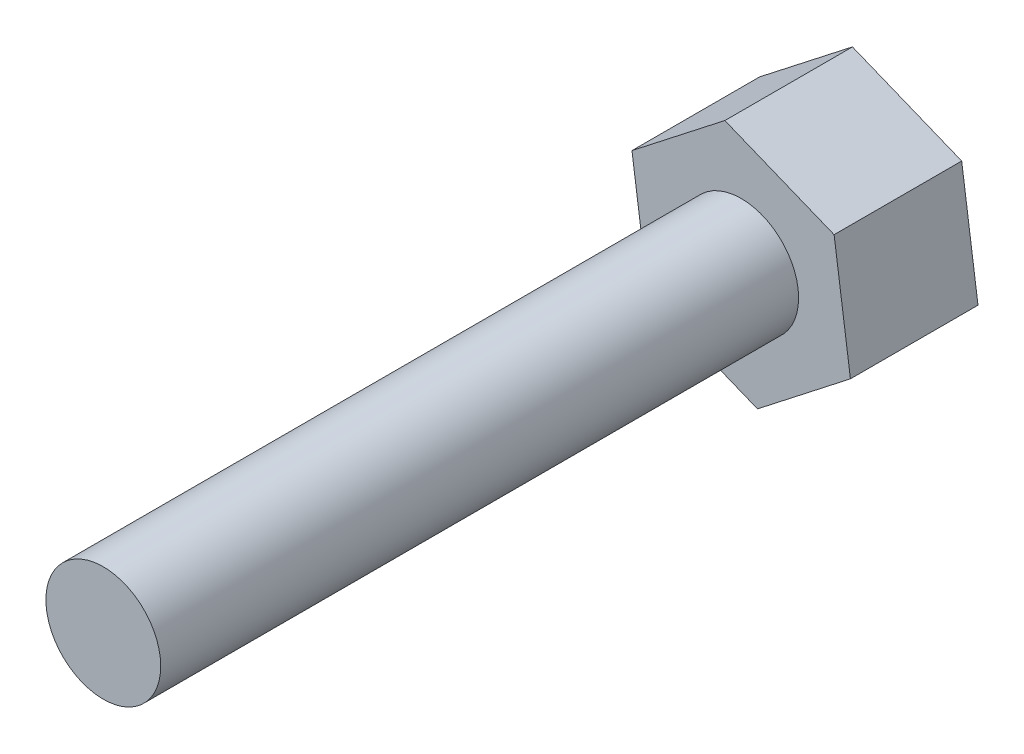
ISO-10303-21;
HEADER;
FILE_DESCRIPTION(('STEP AP214'),'2;1');
FILE_NAME('part.step','',(''),(''),'','','');
FILE_SCHEMA(('AUTOMOTIVE_DESIGN { 1 0 10303 214 1 1 1 1 }'));
ENDSEC;
DATA;
#1=APPLICATION_CONTEXT('core data for automotive mechanical design processes');
#2=APPLICATION_PROTOCOL_DEFINITION('international standard','automotive_design',2000,#1);
#3=PRODUCT_CONTEXT('',#1,'mechanical');
#4=PRODUCT('Part','Part','',(#3));
#5=PRODUCT_RELATED_PRODUCT_CATEGORY('part','',(#4));
#6=PRODUCT_DEFINITION_FORMATION('','',#4);
#7=PRODUCT_DEFINITION_CONTEXT('part definition',#1,'design');
#8=PRODUCT_DEFINITION('design','',#6,#7);
#9=PRODUCT_DEFINITION_SHAPE('','',#8);
#10=(LENGTH_UNIT() NAMED_UNIT(*) SI_UNIT(.MILLI.,.METRE.));
#11=(NAMED_UNIT(*) PLANE_ANGLE_UNIT() SI_UNIT($,.RADIAN.));
#12=(NAMED_UNIT(*) SI_UNIT($,.STERADIAN.) SOLID_ANGLE_UNIT());
#13=UNCERTAINTY_MEASURE_WITH_UNIT(LENGTH_MEASURE(1.E-05),#10,'distance_accuracy_value','');
#14=(GEOMETRIC_REPRESENTATION_CONTEXT(3) GLOBAL_UNCERTAINTY_ASSIGNED_CONTEXT((#13)) GLOBAL_UNIT_ASSIGNED_CONTEXT((#10,
#11,#12)) REPRESENTATION_CONTEXT('',''));
#15=CARTESIAN_POINT('',(0.,0.,0.));
#16=DIRECTION('',(0.,0.,1.));
#17=DIRECTION('',(1.,0.,0.));
#18=AXIS2_PLACEMENT_3D('',#15,#16,#17);
#19=CARTESIAN_POINT('',(4.28109526931957,-1.73365412592678,5.));
#20=DIRECTION('',(-0.990378927300956,-0.138382008795245,0.));
#21=DIRECTION('',(0.138382008795245,-0.990378927300956,0.));
#22=AXIS2_PLACEMENT_3D('',#19,#20,#21);
#23=PLANE('',#22);
#24=DIRECTION('',(-0.138382008795245,0.990378927300956,0.));
#25=VECTOR('',#24,1.);
#26=CARTESIAN_POINT('',(4.28109526931957,-1.73365412592678,0.));
#27=LINE('',#26,#25);
#28=CARTESIAN_POINT('',(4.28109526931957,-1.73365412592678,0.));
#29=VERTEX_POINT('',#28);
#30=CARTESIAN_POINT('',(3.64193614908808,2.84071019628874,0.));
#31=VERTEX_POINT('',#30);
#32=EDGE_CURVE('E119',#29,#31,#27,.T.);
#33=ORIENTED_EDGE('',*,*,#32,.T.);
#34=DIRECTION('',(0.,0.,-1.));
#35=VECTOR('',#34,1.);
#36=CARTESIAN_POINT('',(3.64193614908808,2.84071019628874,5.));
#37=LINE('',#36,#35);
#38=CARTESIAN_POINT('',(3.64193614908808,2.84071019628874,5.));
#39=VERTEX_POINT('',#38);
#40=EDGE_CURVE('E36',#39,#31,#37,.T.);
#41=ORIENTED_EDGE('',*,*,#40,.F.);
#42=DIRECTION('',(-0.138382008795245,0.990378927300956,0.));
#43=VECTOR('',#42,1.);
#44=CARTESIAN_POINT('',(4.28109526931957,-1.73365412592678,5.));
#45=LINE('',#44,#43);
#46=CARTESIAN_POINT('',(4.28109526931957,-1.73365412592678,5.));
#47=VERTEX_POINT('',#46);
#48=EDGE_CURVE('E130',#47,#39,#45,.T.);
#49=ORIENTED_EDGE('',*,*,#48,.F.);
#50=DIRECTION('',(0.,0.,-1.));
#51=VECTOR('',#50,1.);
#52=CARTESIAN_POINT('',(4.28109526931957,-1.73365412592678,5.));
#53=LINE('',#52,#51);
#54=EDGE_CURVE('E115',#47,#29,#53,.T.);
#55=ORIENTED_EDGE('',*,*,#54,.T.);
#56=EDGE_LOOP('',(#33,#41,#49,#55));
#57=FACE_BOUND('',#56,.T.);
#58=ADVANCED_FACE('F33',(#57),#23,.F.);
#59=CARTESIAN_POINT('',(3.64193614908808,2.84071019628874,5.));
#60=DIRECTION('',(-0.375347128607074,-0.926884314813032,0.));
#61=DIRECTION('',(0.926884314813032,-0.375347128607074,0.));
#62=AXIS2_PLACEMENT_3D('',#59,#60,#61);
#63=PLANE('',#62);
#64=DIRECTION('',(-0.926884314813032,0.375347128607074,0.));
#65=VECTOR('',#64,1.);
#66=CARTESIAN_POINT('',(3.64193614908808,2.84071019628874,0.));
#67=LINE('',#66,#65);
#68=CARTESIAN_POINT('',(-0.639159120231486,4.57436432221552,0.));
#69=VERTEX_POINT('',#68);
#70=EDGE_CURVE('E122',#31,#69,#67,.T.);
#71=ORIENTED_EDGE('',*,*,#70,.T.);
#72=DIRECTION('',(0.,0.,-1.));
#73=VECTOR('',#72,1.);
#74=CARTESIAN_POINT('',(-0.639159120231486,4.57436432221552,5.));
#75=LINE('',#74,#73);
#76=CARTESIAN_POINT('',(-0.639159120231486,4.57436432221552,5.));
#77=VERTEX_POINT('',#76);
#78=EDGE_CURVE('E133',#77,#69,#75,.T.);
#79=ORIENTED_EDGE('',*,*,#78,.F.);
#80=DIRECTION('',(-0.926884314813032,0.375347128607074,0.));
#81=VECTOR('',#80,1.);
#82=CARTESIAN_POINT('',(3.64193614908808,2.84071019628874,5.));
#83=LINE('',#82,#81);
#84=EDGE_CURVE('E88',#39,#77,#83,.T.);
#85=ORIENTED_EDGE('',*,*,#84,.F.);
#86=ORIENTED_EDGE('',*,*,#40,.T.);
#87=EDGE_LOOP('',(#71,#79,#85,#86));
#88=FACE_BOUND('',#87,.T.);
#89=ADVANCED_FACE('F138',(#88),#63,.F.);
#90=CARTESIAN_POINT('',(-0.639159120231486,4.57436432221552,5.));
#91=DIRECTION('',(0.615031798693882,-0.788502306017787,0.));
#92=DIRECTION('',(0.788502306017787,0.615031798693882,0.));
#93=AXIS2_PLACEMENT_3D('',#90,#91,#92);
#94=PLANE('',#93);
#95=DIRECTION('',(-0.788502306017787,-0.615031798693882,0.));
#96=VECTOR('',#95,1.);
#97=CARTESIAN_POINT('',(-0.639159120231486,4.57436432221552,0.));
#98=LINE('',#97,#96);
#99=CARTESIAN_POINT('',(-4.28109526931957,1.73365412592678,0.));
#100=VERTEX_POINT('',#99);
#101=EDGE_CURVE('E125',#69,#100,#98,.T.);
#102=ORIENTED_EDGE('',*,*,#101,.T.);
#103=DIRECTION('',(0.,0.,-1.));
#104=VECTOR('',#103,1.);
#105=CARTESIAN_POINT('',(-4.28109526931957,1.73365412592678,5.));
#106=LINE('',#105,#104);
#107=CARTESIAN_POINT('',(-4.28109526931957,1.73365412592678,5.));
#108=VERTEX_POINT('',#107);
#109=EDGE_CURVE('E110',#108,#100,#106,.T.);
#110=ORIENTED_EDGE('',*,*,#109,.F.);
#111=DIRECTION('',(-0.788502306017787,-0.615031798693882,0.));
#112=VECTOR('',#111,1.);
#113=CARTESIAN_POINT('',(-0.639159120231486,4.57436432221552,5.));
#114=LINE('',#113,#112);
#115=EDGE_CURVE('E101',#77,#108,#114,.T.);
#116=ORIENTED_EDGE('',*,*,#115,.F.);
#117=ORIENTED_EDGE('',*,*,#78,.T.);
#118=EDGE_LOOP('',(#102,#110,#116,#117));
#119=FACE_BOUND('',#118,.T.);
#120=ADVANCED_FACE('F144',(#119),#94,.F.);
#121=CARTESIAN_POINT('',(-4.28109526931957,1.73365412592678,5.));
#122=DIRECTION('',(0.990378927300956,0.138382008795245,0.));
#123=DIRECTION('',(-0.138382008795245,0.990378927300956,0.));
#124=AXIS2_PLACEMENT_3D('',#121,#122,#123);
#125=PLANE('',#124);
#126=DIRECTION('',(0.138382008795245,-0.990378927300956,0.));
#127=VECTOR('',#126,1.);
#128=CARTESIAN_POINT('',(-4.28109526931957,1.73365412592678,0.));
#129=LINE('',#128,#127);
#130=CARTESIAN_POINT('',(-3.64193614908808,-2.84071019628874,0.));
#131=VERTEX_POINT('',#130);
#132=EDGE_CURVE('E109',#100,#131,#129,.T.);
#133=ORIENTED_EDGE('',*,*,#132,.T.);
#134=DIRECTION('',(0.,0.,-1.));
#135=VECTOR('',#134,1.);
#136=CARTESIAN_POINT('',(-3.64193614908808,-2.84071019628874,5.));
#137=LINE('',#136,#135);
#138=CARTESIAN_POINT('',(-3.64193614908808,-2.84071019628874,5.));
#139=VERTEX_POINT('',#138);
#140=EDGE_CURVE('E106',#139,#131,#137,.T.);
#141=ORIENTED_EDGE('',*,*,#140,.F.);
#142=DIRECTION('',(0.138382008795245,-0.990378927300956,0.));
#143=VECTOR('',#142,1.);
#144=CARTESIAN_POINT('',(-4.28109526931957,1.73365412592678,5.));
#145=LINE('',#144,#143);
#146=EDGE_CURVE('E95',#108,#139,#145,.T.);
#147=ORIENTED_EDGE('',*,*,#146,.F.);
#148=ORIENTED_EDGE('',*,*,#109,.T.);
#149=EDGE_LOOP('',(#133,#141,#147,#148));
#150=FACE_BOUND('',#149,.T.);
#151=ADVANCED_FACE('F107',(#150),#125,.F.);
#152=CARTESIAN_POINT('',(-3.64193614908808,-2.84071019628874,5.));
#153=DIRECTION('',(0.375347128607075,0.926884314813032,0.));
#154=DIRECTION('',(-0.926884314813032,0.375347128607075,0.));
#155=AXIS2_PLACEMENT_3D('',#152,#153,#154);
#156=PLANE('',#155);
#157=DIRECTION('',(0.926884314813032,-0.375347128607075,0.));
#158=VECTOR('',#157,1.);
#159=CARTESIAN_POINT('',(-3.64193614908808,-2.84071019628874,0.));
#160=LINE('',#159,#158);
#161=CARTESIAN_POINT('',(0.639159120231486,-4.57436432221552,0.));
#162=VERTEX_POINT('',#161);
#163=EDGE_CURVE('E73',#131,#162,#160,.T.);
#164=ORIENTED_EDGE('',*,*,#163,.T.);
#165=DIRECTION('',(0.,0.,-1.));
#166=VECTOR('',#165,1.);
#167=CARTESIAN_POINT('',(0.639159120231486,-4.57436432221552,5.));
#168=LINE('',#167,#166);
#169=CARTESIAN_POINT('',(0.639159120231486,-4.57436432221552,5.));
#170=VERTEX_POINT('',#169);
#171=EDGE_CURVE('E111',#170,#162,#168,.T.);
#172=ORIENTED_EDGE('',*,*,#171,.F.);
#173=DIRECTION('',(0.926884314813032,-0.375347128607075,0.));
#174=VECTOR('',#173,1.);
#175=CARTESIAN_POINT('',(-3.64193614908808,-2.84071019628874,5.));
#176=LINE('',#175,#174);
#177=EDGE_CURVE('E99',#139,#170,#176,.T.);
#178=ORIENTED_EDGE('',*,*,#177,.F.);
#179=ORIENTED_EDGE('',*,*,#140,.T.);
#180=EDGE_LOOP('',(#164,#172,#178,#179));
#181=FACE_BOUND('',#180,.T.);
#182=ADVANCED_FACE('F113',(#181),#156,.F.);
#183=CARTESIAN_POINT('',(0.639159120231486,-4.57436432221552,5.));
#184=DIRECTION('',(-0.615031798693882,0.788502306017787,0.));
#185=DIRECTION('',(-0.788502306017787,-0.615031798693882,0.));
#186=AXIS2_PLACEMENT_3D('',#183,#184,#185);
#187=PLANE('',#186);
#188=DIRECTION('',(0.788502306017787,0.615031798693882,0.));
#189=VECTOR('',#188,1.);
#190=CARTESIAN_POINT('',(0.639159120231486,-4.57436432221552,0.));
#191=LINE('',#190,#189);
#192=EDGE_CURVE('E79',#162,#29,#191,.T.);
#193=ORIENTED_EDGE('',*,*,#192,.T.);
#194=ORIENTED_EDGE('',*,*,#54,.F.);
#195=DIRECTION('',(0.788502306017787,0.615031798693882,0.));
#196=VECTOR('',#195,1.);
#197=CARTESIAN_POINT('',(0.639159120231486,-4.57436432221552,5.));
#198=LINE('',#197,#196);
#199=EDGE_CURVE('E50',#170,#47,#198,.T.);
#200=ORIENTED_EDGE('',*,*,#199,.F.);
#201=ORIENTED_EDGE('',*,*,#171,.T.);
#202=EDGE_LOOP('',(#193,#194,#200,#201));
#203=FACE_BOUND('',#202,.T.);
#204=ADVANCED_FACE('F160',(#203),#187,.F.);
#205=CARTESIAN_POINT('',(0.,0.,5.));
#206=DIRECTION('',(0.,0.,1.));
#207=DIRECTION('',(1.,0.,0.));
#208=AXIS2_PLACEMENT_3D('',#205,#206,#207);
#209=PLANE('',#208);
#210=CARTESIAN_POINT('',(0.,0.,5.));
#211=DIRECTION('',(0.,0.,1.));
#212=DIRECTION('',(1.,0.,0.));
#213=AXIS2_PLACEMENT_3D('',#210,#211,#212);
#214=CIRCLE('',#213,2.25);
#215=CARTESIAN_POINT('',(2.25,0.,5.));
#216=VERTEX_POINT('',#215);
#217=EDGE_CURVE('E11',#216,#216,#214,.T.);
#218=ORIENTED_EDGE('',*,*,#217,.F.);
#219=EDGE_LOOP('',(#218));
#220=FACE_BOUND('',#219,.T.);
#221=ORIENTED_EDGE('',*,*,#48,.T.);
#222=ORIENTED_EDGE('',*,*,#84,.T.);
#223=ORIENTED_EDGE('',*,*,#115,.T.);
#224=ORIENTED_EDGE('',*,*,#146,.T.);
#225=ORIENTED_EDGE('',*,*,#177,.T.);
#226=ORIENTED_EDGE('',*,*,#199,.T.);
#227=EDGE_LOOP('',(#221,#222,#223,#224,#225,#226));
#228=FACE_BOUND('',#227,.T.);
#229=ADVANCED_FACE('F97',(#220,#228),#209,.T.);
#230=CARTESIAN_POINT('',(0.,0.,0.));
#231=DIRECTION('',(0.,0.,1.));
#232=DIRECTION('',(1.,0.,0.));
#233=AXIS2_PLACEMENT_3D('',#230,#231,#232);
#234=PLANE('',#233);
#235=ORIENTED_EDGE('',*,*,#32,.F.);
#236=ORIENTED_EDGE('',*,*,#192,.F.);
#237=ORIENTED_EDGE('',*,*,#163,.F.);
#238=ORIENTED_EDGE('',*,*,#132,.F.);
#239=ORIENTED_EDGE('',*,*,#101,.F.);
#240=ORIENTED_EDGE('',*,*,#70,.F.);
#241=EDGE_LOOP('',(#235,#236,#237,#238,#239,#240));
#242=FACE_BOUND('',#241,.T.);
#243=ADVANCED_FACE('F143',(#242),#234,.F.);
#244=CARTESIAN_POINT('',(0.,0.,30.));
#245=DIRECTION('',(0.,0.,-1.));
#246=DIRECTION('',(-1.,0.,0.));
#247=AXIS2_PLACEMENT_3D('',#244,#245,#246);
#248=CYLINDRICAL_SURFACE('',#247,2.25);
#249=CARTESIAN_POINT('',(0.,0.,30.));
#250=DIRECTION('',(0.,0.,1.));
#251=DIRECTION('',(1.,0.,0.));
#252=AXIS2_PLACEMENT_3D('',#249,#250,#251);
#253=CIRCLE('',#252,2.25);
#254=CARTESIAN_POINT('',(2.25,0.,30.));
#255=VERTEX_POINT('',#254);
#256=EDGE_CURVE('E123',#255,#255,#253,.T.);
#257=ORIENTED_EDGE('',*,*,#256,.F.);
#258=EDGE_LOOP('',(#257));
#259=FACE_BOUND('',#258,.T.);
#260=ORIENTED_EDGE('',*,*,#217,.T.);
#261=EDGE_LOOP('',(#260));
#262=FACE_BOUND('',#261,.T.);
#263=ADVANCED_FACE('F153',(#259,#262),#248,.T.);
#264=CARTESIAN_POINT('',(0.,0.,30.));
#265=DIRECTION('',(0.,0.,1.));
#266=DIRECTION('',(1.,0.,0.));
#267=AXIS2_PLACEMENT_3D('',#264,#265,#266);
#268=PLANE('',#267);
#269=ORIENTED_EDGE('',*,*,#256,.T.);
#270=EDGE_LOOP('',(#269));
#271=FACE_BOUND('',#270,.T.);
#272=ADVANCED_FACE('F151',(#271),#268,.T.);
#273=CLOSED_SHELL('',(#58,#89,#120,#151,#182,#204,#229,#243,#263,#272));
#274=MANIFOLD_SOLID_BREP('B2',#273);
#275=ADVANCED_BREP_SHAPE_REPRESENTATION('',(#18,#274),#14);
#276=SHAPE_DEFINITION_REPRESENTATION(#9,#275);
ENDSEC;
END-ISO-10303-21;
